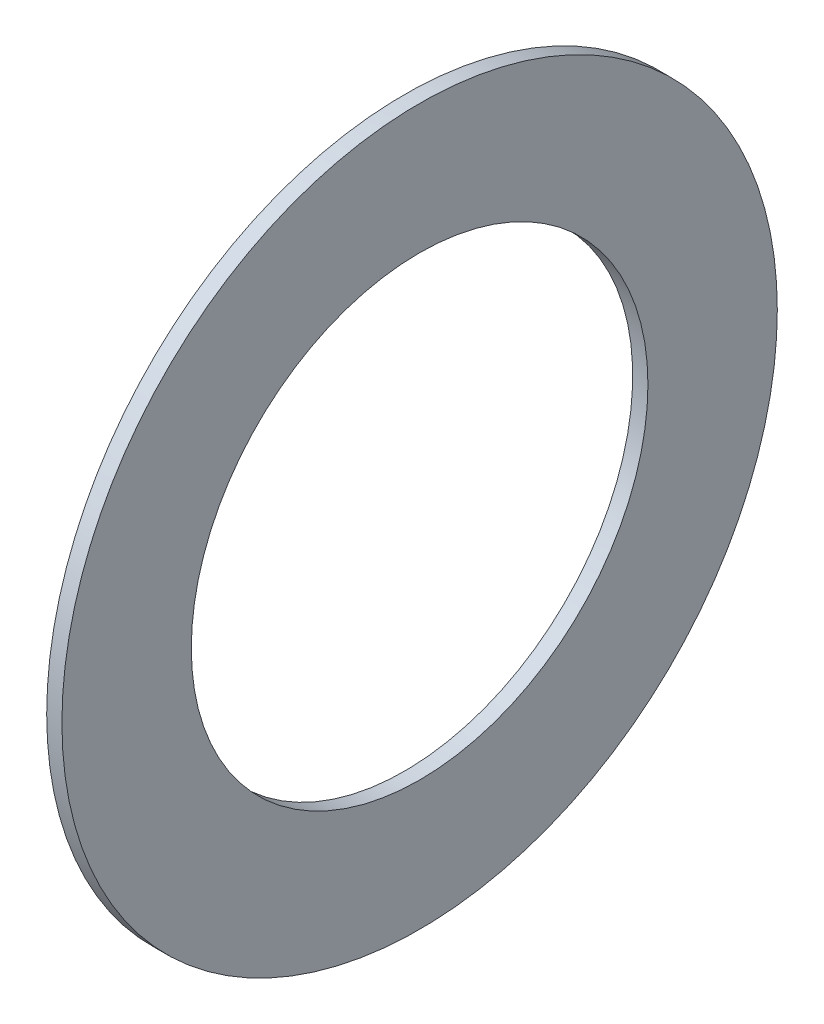
ISO-10303-21;
HEADER;
FILE_DESCRIPTION(('STEP AP214'),'2;1');
FILE_NAME('part.step','',(''),(''),'','','');
FILE_SCHEMA(('AUTOMOTIVE_DESIGN { 1 0 10303 214 1 1 1 1 }'));
ENDSEC;
DATA;
#1=APPLICATION_CONTEXT('core data for automotive mechanical design processes');
#2=APPLICATION_PROTOCOL_DEFINITION('international standard','automotive_design',2000,#1);
#3=PRODUCT_CONTEXT('',#1,'mechanical');
#4=PRODUCT('Part','Part','',(#3));
#5=PRODUCT_RELATED_PRODUCT_CATEGORY('part','',(#4));
#6=PRODUCT_DEFINITION_FORMATION('','',#4);
#7=PRODUCT_DEFINITION_CONTEXT('part definition',#1,'design');
#8=PRODUCT_DEFINITION('design','',#6,#7);
#9=PRODUCT_DEFINITION_SHAPE('','',#8);
#10=(LENGTH_UNIT() NAMED_UNIT(*) SI_UNIT(.MILLI.,.METRE.));
#11=(NAMED_UNIT(*) PLANE_ANGLE_UNIT() SI_UNIT($,.RADIAN.));
#12=(NAMED_UNIT(*) SI_UNIT($,.STERADIAN.) SOLID_ANGLE_UNIT());
#13=UNCERTAINTY_MEASURE_WITH_UNIT(LENGTH_MEASURE(1.E-05),#10,'distance_accuracy_value','');
#14=(GEOMETRIC_REPRESENTATION_CONTEXT(3) GLOBAL_UNCERTAINTY_ASSIGNED_CONTEXT((#13)) GLOBAL_UNIT_ASSIGNED_CONTEXT((#10,
#11,#12)) REPRESENTATION_CONTEXT('',''));
#15=CARTESIAN_POINT('',(0.,0.,0.));
#16=DIRECTION('',(0.,0.,1.));
#17=DIRECTION('',(1.,0.,0.));
#18=AXIS2_PLACEMENT_3D('',#15,#16,#17);
#19=CARTESIAN_POINT('',(-2.,-23.9365440641238,-23.5));
#20=DIRECTION('',(-1.,0.,0.));
#21=DIRECTION('',(0.,0.,1.));
#22=AXIS2_PLACEMENT_3D('',#19,#20,#21);
#23=PLANE('',#22);
#24=CARTESIAN_POINT('',(-2.,0.,0.));
#25=DIRECTION('',(-1.,0.,0.));
#26=DIRECTION('',(0.,0.,-1.));
#27=AXIS2_PLACEMENT_3D('',#24,#25,#26);
#28=CIRCLE('',#27,23.5);
#29=CARTESIAN_POINT('',(-2.,0.,-23.5));
#30=VERTEX_POINT('',#29);
#31=EDGE_CURVE('E30',#30,#30,#28,.F.);
#32=ORIENTED_EDGE('',*,*,#31,.F.);
#33=EDGE_LOOP('',(#32));
#34=FACE_BOUND('',#33,.T.);
#35=CARTESIAN_POINT('',(-2.,0.,0.));
#36=DIRECTION('',(1.,0.,0.));
#37=DIRECTION('',(0.,0.,1.));
#38=AXIS2_PLACEMENT_3D('',#35,#36,#37);
#39=CIRCLE('',#38,15.);
#40=CARTESIAN_POINT('',(-2.,0.,15.));
#41=VERTEX_POINT('',#40);
#42=EDGE_CURVE('E26',#41,#41,#39,.T.);
#43=ORIENTED_EDGE('',*,*,#42,.T.);
#44=EDGE_LOOP('',(#43));
#45=FACE_BOUND('',#44,.T.);
#46=ADVANCED_FACE('F15',(#34,#45),#23,.T.);
#47=CARTESIAN_POINT('',(-1.,-23.9365440779555,23.5));
#48=DIRECTION('',(1.,0.,0.));
#49=DIRECTION('',(0.,0.,-1.));
#50=AXIS2_PLACEMENT_3D('',#47,#48,#49);
#51=PLANE('',#50);
#52=CARTESIAN_POINT('',(-1.,0.,0.));
#53=DIRECTION('',(1.,0.,0.));
#54=DIRECTION('',(0.,0.,1.));
#55=AXIS2_PLACEMENT_3D('',#52,#53,#54);
#56=CIRCLE('',#55,23.5);
#57=CARTESIAN_POINT('',(-1.,0.,23.5));
#58=VERTEX_POINT('',#57);
#59=EDGE_CURVE('E22',#58,#58,#56,.T.);
#60=ORIENTED_EDGE('',*,*,#59,.T.);
#61=EDGE_LOOP('',(#60));
#62=FACE_BOUND('',#61,.T.);
#63=CARTESIAN_POINT('',(-1.,0.,0.));
#64=DIRECTION('',(-1.,0.,0.));
#65=DIRECTION('',(0.,0.,-1.));
#66=AXIS2_PLACEMENT_3D('',#63,#64,#65);
#67=CIRCLE('',#66,15.);
#68=CARTESIAN_POINT('',(-1.,0.,-15.));
#69=VERTEX_POINT('',#68);
#70=EDGE_CURVE('E10',#69,#69,#67,.F.);
#71=ORIENTED_EDGE('',*,*,#70,.F.);
#72=EDGE_LOOP('',(#71));
#73=FACE_BOUND('',#72,.T.);
#74=ADVANCED_FACE('F40',(#62,#73),#51,.T.);
#75=CARTESIAN_POINT('',(50.,0.,0.));
#76=DIRECTION('',(1.,0.,0.));
#77=DIRECTION('',(0.,0.,1.));
#78=AXIS2_PLACEMENT_3D('',#75,#76,#77);
#79=CYLINDRICAL_SURFACE('',#78,15.);
#80=ORIENTED_EDGE('',*,*,#70,.T.);
#81=EDGE_LOOP('',(#80));
#82=FACE_BOUND('',#81,.T.);
#83=ORIENTED_EDGE('',*,*,#42,.F.);
#84=EDGE_LOOP('',(#83));
#85=FACE_BOUND('',#84,.T.);
#86=ADVANCED_FACE('F44',(#82,#85),#79,.F.);
#87=CARTESIAN_POINT('',(50.,0.,0.));
#88=DIRECTION('',(1.,0.,0.));
#89=DIRECTION('',(0.,1.16851962584527E-09,1.));
#90=AXIS2_PLACEMENT_3D('',#87,#88,#89);
#91=CYLINDRICAL_SURFACE('',#90,23.5);
#92=ORIENTED_EDGE('',*,*,#31,.T.);
#93=EDGE_LOOP('',(#92));
#94=FACE_BOUND('',#93,.T.);
#95=ORIENTED_EDGE('',*,*,#59,.F.);
#96=EDGE_LOOP('',(#95));
#97=FACE_BOUND('',#96,.T.);
#98=ADVANCED_FACE('F17',(#94,#97),#91,.T.);
#99=CLOSED_SHELL('',(#46,#74,#86,#98));
#100=MANIFOLD_SOLID_BREP('B1',#99);
#101=ADVANCED_BREP_SHAPE_REPRESENTATION('',(#18,#100),#14);
#102=SHAPE_DEFINITION_REPRESENTATION(#9,#101);
ENDSEC;
END-ISO-10303-21;
